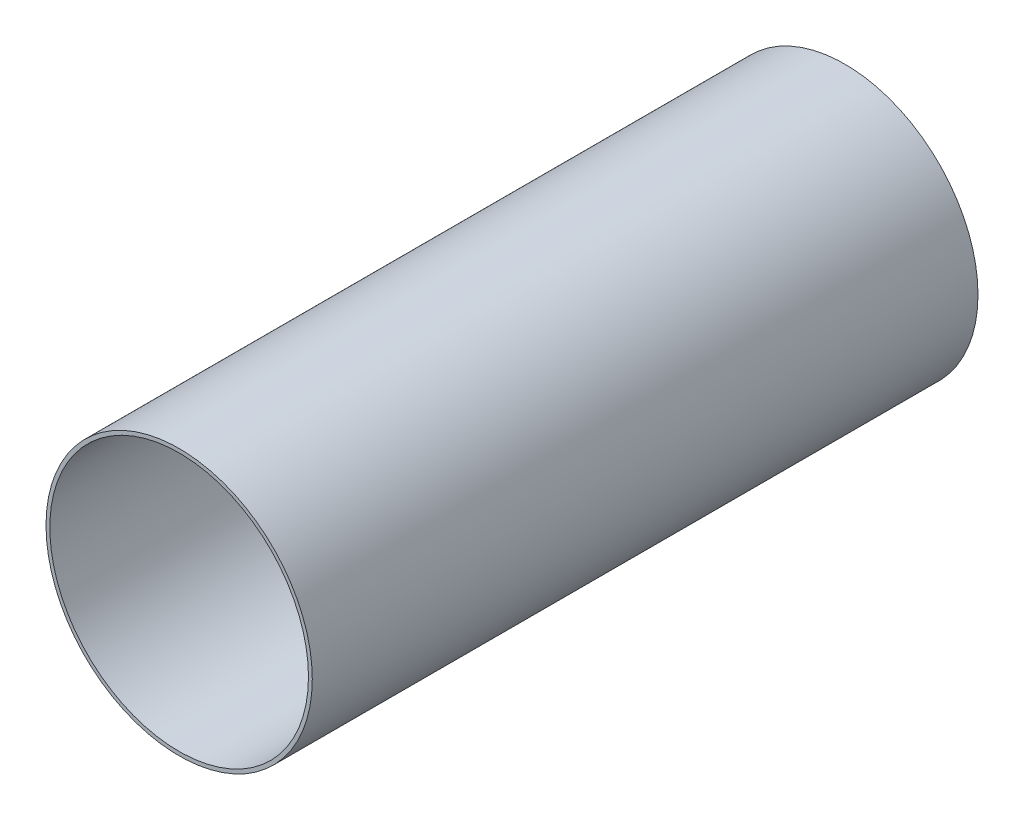
ISO-10303-21;
HEADER;
FILE_DESCRIPTION(('STEP AP214'),'2;1');
FILE_NAME('part.step','',(''),(''),'','','');
FILE_SCHEMA(('AUTOMOTIVE_DESIGN { 1 0 10303 214 1 1 1 1 }'));
ENDSEC;
DATA;
#1=APPLICATION_CONTEXT('core data for automotive mechanical design processes');
#2=APPLICATION_PROTOCOL_DEFINITION('international standard','automotive_design',2000,#1);
#3=PRODUCT_CONTEXT('',#1,'mechanical');
#4=PRODUCT('Part','Part','',(#3));
#5=PRODUCT_RELATED_PRODUCT_CATEGORY('part','',(#4));
#6=PRODUCT_DEFINITION_FORMATION('','',#4);
#7=PRODUCT_DEFINITION_CONTEXT('part definition',#1,'design');
#8=PRODUCT_DEFINITION('design','',#6,#7);
#9=PRODUCT_DEFINITION_SHAPE('','',#8);
#10=(LENGTH_UNIT() NAMED_UNIT(*) SI_UNIT(.MILLI.,.METRE.));
#11=(NAMED_UNIT(*) PLANE_ANGLE_UNIT() SI_UNIT($,.RADIAN.));
#12=(NAMED_UNIT(*) SI_UNIT($,.STERADIAN.) SOLID_ANGLE_UNIT());
#13=UNCERTAINTY_MEASURE_WITH_UNIT(LENGTH_MEASURE(1.E-05),#10,'distance_accuracy_value','');
#14=(GEOMETRIC_REPRESENTATION_CONTEXT(3) GLOBAL_UNCERTAINTY_ASSIGNED_CONTEXT((#13)) GLOBAL_UNIT_ASSIGNED_CONTEXT((#10,
#11,#12)) REPRESENTATION_CONTEXT('',''));
#15=CARTESIAN_POINT('',(0.,0.,0.));
#16=DIRECTION('',(0.,0.,1.));
#17=DIRECTION('',(1.,0.,0.));
#18=AXIS2_PLACEMENT_3D('',#15,#16,#17);
#19=CARTESIAN_POINT('',(0.,0.,87.5));
#20=DIRECTION('',(0.,0.,1.));
#21=DIRECTION('',(1.,0.,0.));
#22=AXIS2_PLACEMENT_3D('',#19,#20,#21);
#23=PLANE('',#22);
#24=CARTESIAN_POINT('',(0.,0.,87.5));
#25=DIRECTION('',(0.,0.,1.));
#26=DIRECTION('',(1.,0.,0.));
#27=AXIS2_PLACEMENT_3D('',#24,#25,#26);
#28=CIRCLE('',#27,17.5);
#29=CARTESIAN_POINT('',(17.5,0.,87.5));
#30=VERTEX_POINT('',#29);
#31=EDGE_CURVE('E10',#30,#30,#28,.T.);
#32=ORIENTED_EDGE('',*,*,#31,.T.);
#33=EDGE_LOOP('',(#32));
#34=FACE_BOUND('',#33,.T.);
#35=CARTESIAN_POINT('',(0.,0.,87.5));
#36=DIRECTION('',(0.,0.,1.));
#37=DIRECTION('',(1.,0.,0.));
#38=AXIS2_PLACEMENT_3D('',#35,#36,#37);
#39=CIRCLE('',#38,17.);
#40=CARTESIAN_POINT('',(17.,0.,87.5));
#41=VERTEX_POINT('',#40);
#42=EDGE_CURVE('E50',#41,#41,#39,.T.);
#43=ORIENTED_EDGE('',*,*,#42,.F.);
#44=EDGE_LOOP('',(#43));
#45=FACE_BOUND('',#44,.T.);
#46=ADVANCED_FACE('F37',(#34,#45),#23,.T.);
#47=CARTESIAN_POINT('',(0.,0.,0.));
#48=DIRECTION('',(0.,0.,1.));
#49=DIRECTION('',(1.,0.,0.));
#50=AXIS2_PLACEMENT_3D('',#47,#48,#49);
#51=PLANE('',#50);
#52=CARTESIAN_POINT('',(0.,0.,0.));
#53=DIRECTION('',(0.,0.,1.));
#54=DIRECTION('',(1.,0.,0.));
#55=AXIS2_PLACEMENT_3D('',#52,#53,#54);
#56=CIRCLE('',#55,17.5);
#57=CARTESIAN_POINT('',(17.5,0.,0.));
#58=VERTEX_POINT('',#57);
#59=EDGE_CURVE('E41',#58,#58,#56,.T.);
#60=ORIENTED_EDGE('',*,*,#59,.F.);
#61=EDGE_LOOP('',(#60));
#62=FACE_BOUND('',#61,.T.);
#63=CARTESIAN_POINT('',(0.,0.,0.));
#64=DIRECTION('',(0.,0.,1.));
#65=DIRECTION('',(1.,0.,0.));
#66=AXIS2_PLACEMENT_3D('',#63,#64,#65);
#67=CIRCLE('',#66,17.);
#68=CARTESIAN_POINT('',(17.,0.,0.));
#69=VERTEX_POINT('',#68);
#70=EDGE_CURVE('E52',#69,#69,#67,.T.);
#71=ORIENTED_EDGE('',*,*,#70,.T.);
#72=EDGE_LOOP('',(#71));
#73=FACE_BOUND('',#72,.T.);
#74=ADVANCED_FACE('F64',(#62,#73),#51,.F.);
#75=CARTESIAN_POINT('',(0.,0.,87.5));
#76=DIRECTION('',(0.,0.,-1.));
#77=DIRECTION('',(-1.,0.,0.));
#78=AXIS2_PLACEMENT_3D('',#75,#76,#77);
#79=CYLINDRICAL_SURFACE('',#78,17.5);
#80=ORIENTED_EDGE('',*,*,#31,.F.);
#81=EDGE_LOOP('',(#80));
#82=FACE_BOUND('',#81,.T.);
#83=ORIENTED_EDGE('',*,*,#59,.T.);
#84=EDGE_LOOP('',(#83));
#85=FACE_BOUND('',#84,.T.);
#86=ADVANCED_FACE('F39',(#82,#85),#79,.T.);
#87=CARTESIAN_POINT('',(0.,0.,87.5));
#88=DIRECTION('',(0.,0.,-1.));
#89=DIRECTION('',(-1.,0.,0.));
#90=AXIS2_PLACEMENT_3D('',#87,#88,#89);
#91=CYLINDRICAL_SURFACE('',#90,17.);
#92=ORIENTED_EDGE('',*,*,#42,.T.);
#93=EDGE_LOOP('',(#92));
#94=FACE_BOUND('',#93,.T.);
#95=ORIENTED_EDGE('',*,*,#70,.F.);
#96=EDGE_LOOP('',(#95));
#97=FACE_BOUND('',#96,.T.);
#98=ADVANCED_FACE('F60',(#94,#97),#91,.F.);
#99=CLOSED_SHELL('',(#46,#74,#86,#98));
#100=MANIFOLD_SOLID_BREP('B2',#99);
#101=ADVANCED_BREP_SHAPE_REPRESENTATION('',(#18,#100),#14);
#102=SHAPE_DEFINITION_REPRESENTATION(#9,#101);
ENDSEC;
END-ISO-10303-21;
